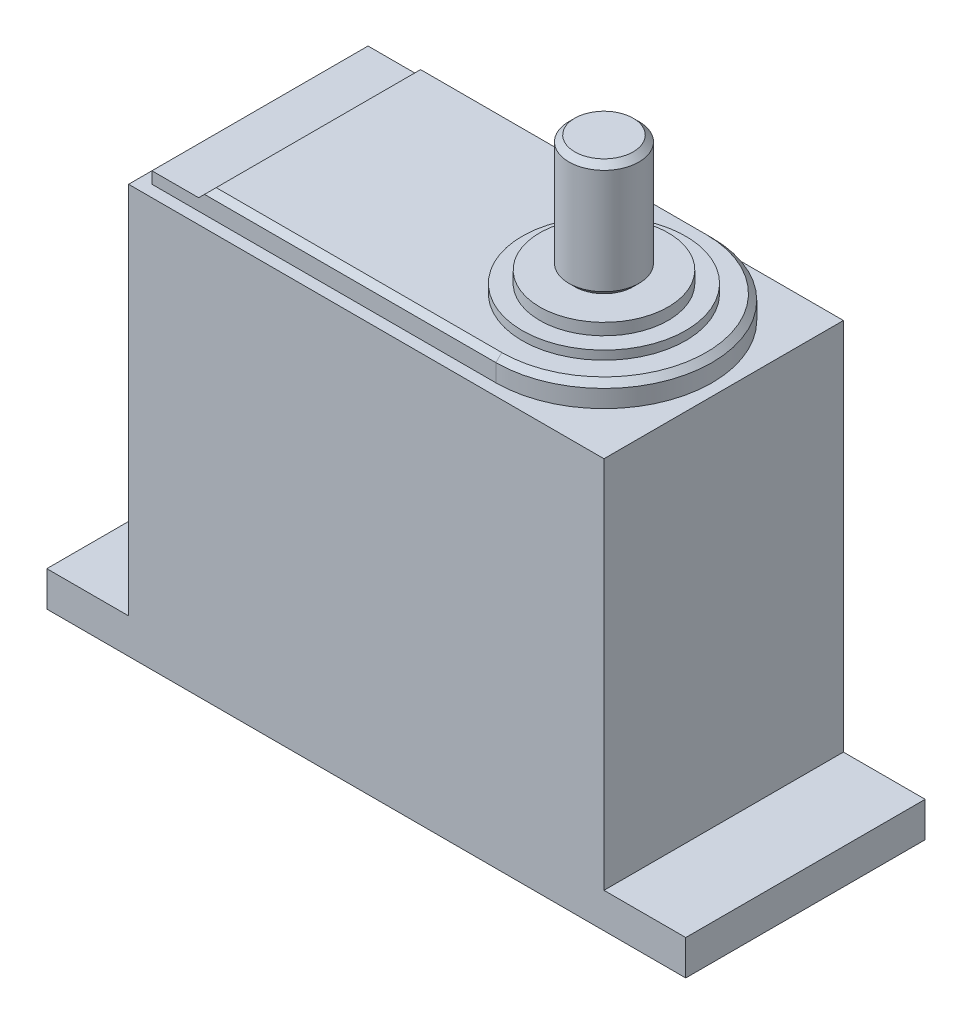
ISO-10303-21;
HEADER;
FILE_DESCRIPTION(('STEP AP214'),'2;1');
FILE_NAME('part.step','',(''),(''),'','','');
FILE_SCHEMA(('AUTOMOTIVE_DESIGN { 1 0 10303 214 1 1 1 1 }'));
ENDSEC;
DATA;
#1=APPLICATION_CONTEXT('core data for automotive mechanical design processes');
#2=APPLICATION_PROTOCOL_DEFINITION('international standard','automotive_design',2000,#1);
#3=PRODUCT_CONTEXT('',#1,'mechanical');
#4=PRODUCT('Part','Part','',(#3));
#5=PRODUCT_RELATED_PRODUCT_CATEGORY('part','',(#4));
#6=PRODUCT_DEFINITION_FORMATION('','',#4);
#7=PRODUCT_DEFINITION_CONTEXT('part definition',#1,'design');
#8=PRODUCT_DEFINITION('design','',#6,#7);
#9=PRODUCT_DEFINITION_SHAPE('','',#8);
#10=(LENGTH_UNIT() NAMED_UNIT(*) SI_UNIT(.MILLI.,.METRE.));
#11=(NAMED_UNIT(*) PLANE_ANGLE_UNIT() SI_UNIT($,.RADIAN.));
#12=(NAMED_UNIT(*) SI_UNIT($,.STERADIAN.) SOLID_ANGLE_UNIT());
#13=UNCERTAINTY_MEASURE_WITH_UNIT(LENGTH_MEASURE(1.E-05),#10,'distance_accuracy_value','');
#14=(GEOMETRIC_REPRESENTATION_CONTEXT(3) GLOBAL_UNCERTAINTY_ASSIGNED_CONTEXT((#13)) GLOBAL_UNIT_ASSIGNED_CONTEXT((#10,
#11,#12)) REPRESENTATION_CONTEXT('',''));
#15=CARTESIAN_POINT('',(0.,0.,0.));
#16=DIRECTION('',(0.,0.,1.));
#17=DIRECTION('',(1.,0.,0.));
#18=AXIS2_PLACEMENT_3D('',#15,#16,#17);
#19=CARTESIAN_POINT('',(10.1,21.25,0.));
#20=DIRECTION('',(0.,1.,0.));
#21=DIRECTION('',(0.,0.,1.));
#22=AXIS2_PLACEMENT_3D('',#19,#20,#21);
#23=PLANE('',#22);
#24=CARTESIAN_POINT('',(10.1,21.25,0.));
#25=DIRECTION('',(0.,1.,0.));
#26=DIRECTION('',(0.,0.,1.));
#27=AXIS2_PLACEMENT_3D('',#24,#25,#26);
#28=CIRCLE('',#27,5.5);
#29=CARTESIAN_POINT('',(10.1,21.25,5.5));
#30=VERTEX_POINT('',#29);
#31=EDGE_CURVE('E232',#30,#30,#28,.T.);
#32=ORIENTED_EDGE('',*,*,#31,.T.);
#33=EDGE_LOOP('',(#32));
#34=FACE_BOUND('',#33,.T.);
#35=CARTESIAN_POINT('',(10.1,21.25,0.));
#36=DIRECTION('',(0.,1.,0.));
#37=DIRECTION('',(0.,0.,1.));
#38=AXIS2_PLACEMENT_3D('',#35,#36,#37);
#39=CIRCLE('',#38,2.5);
#40=CARTESIAN_POINT('',(10.1,21.25,2.5));
#41=VERTEX_POINT('',#40);
#42=EDGE_CURVE('E223',#41,#41,#39,.T.);
#43=ORIENTED_EDGE('',*,*,#42,.F.);
#44=EDGE_LOOP('',(#43));
#45=FACE_BOUND('',#44,.T.);
#46=ADVANCED_FACE('F34',(#34,#45),#23,.T.);
#47=CARTESIAN_POINT('',(10.1,20.25,0.));
#48=DIRECTION('',(0.,1.,0.));
#49=DIRECTION('',(0.,0.,1.));
#50=AXIS2_PLACEMENT_3D('',#47,#48,#49);
#51=PLANE('',#50);
#52=CARTESIAN_POINT('',(10.1,20.25,0.));
#53=DIRECTION('',(0.,1.,0.));
#54=DIRECTION('',(0.,0.,1.));
#55=AXIS2_PLACEMENT_3D('',#52,#53,#54);
#56=CIRCLE('',#55,7.);
#57=CARTESIAN_POINT('',(10.1,20.25,7.));
#58=VERTEX_POINT('',#57);
#59=EDGE_CURVE('E238',#58,#58,#56,.T.);
#60=ORIENTED_EDGE('',*,*,#59,.T.);
#61=EDGE_LOOP('',(#60));
#62=FACE_BOUND('',#61,.T.);
#63=CARTESIAN_POINT('',(10.1,20.25,0.));
#64=DIRECTION('',(0.,1.,0.));
#65=DIRECTION('',(0.,0.,1.));
#66=AXIS2_PLACEMENT_3D('',#63,#64,#65);
#67=CIRCLE('',#66,5.5);
#68=CARTESIAN_POINT('',(10.1,20.25,5.5));
#69=VERTEX_POINT('',#68);
#70=EDGE_CURVE('E221',#69,#69,#67,.T.);
#71=ORIENTED_EDGE('',*,*,#70,.F.);
#72=EDGE_LOOP('',(#71));
#73=FACE_BOUND('',#72,.T.);
#74=ADVANCED_FACE('F327',(#62,#73),#51,.T.);
#75=CARTESIAN_POINT('',(10.1,19.5,0.));
#76=DIRECTION('',(0.,1.,0.));
#77=DIRECTION('',(0.,0.,1.));
#78=AXIS2_PLACEMENT_3D('',#75,#76,#77);
#79=PLANE('',#78);
#80=CARTESIAN_POINT('',(10.1,19.5,0.));
#81=DIRECTION('',(0.,1.,0.));
#82=DIRECTION('',(0.,0.,1.));
#83=AXIS2_PLACEMENT_3D('',#80,#81,#82);
#84=CIRCLE('',#83,8.75);
#85=CARTESIAN_POINT('',(10.1,19.5,8.75));
#86=VERTEX_POINT('',#85);
#87=CARTESIAN_POINT('',(10.1,19.5,-8.75000000000001));
#88=VERTEX_POINT('',#87);
#89=EDGE_CURVE('E202',#86,#88,#84,.T.);
#90=ORIENTED_EDGE('',*,*,#89,.T.);
#91=DIRECTION('',(-1.,0.,0.));
#92=VECTOR('',#91,1.);
#93=CARTESIAN_POINT('',(-14.35,19.5,-8.75000000000001));
#94=LINE('',#93,#92);
#95=CARTESIAN_POINT('',(-14.35,19.5,-8.75000000000001));
#96=VERTEX_POINT('',#95);
#97=EDGE_CURVE('E204',#88,#96,#94,.T.);
#98=ORIENTED_EDGE('',*,*,#97,.T.);
#99=DIRECTION('',(0.,0.,1.));
#100=VECTOR('',#99,1.);
#101=CARTESIAN_POINT('',(-14.35,19.5,-9.25));
#102=LINE('',#101,#100);
#103=CARTESIAN_POINT('',(-14.35,19.5,8.75000000000001));
#104=VERTEX_POINT('',#103);
#105=EDGE_CURVE('E256',#96,#104,#102,.T.);
#106=ORIENTED_EDGE('',*,*,#105,.T.);
#107=DIRECTION('',(1.,0.,0.));
#108=VECTOR('',#107,1.);
#109=CARTESIAN_POINT('',(10.1,19.5,8.75));
#110=LINE('',#109,#108);
#111=EDGE_CURVE('E200',#104,#86,#110,.T.);
#112=ORIENTED_EDGE('',*,*,#111,.T.);
#113=EDGE_LOOP('',(#90,#98,#106,#112));
#114=FACE_BOUND('',#113,.T.);
#115=CARTESIAN_POINT('',(10.1,19.5,0.));
#116=DIRECTION('',(0.,1.,0.));
#117=DIRECTION('',(0.,0.,1.));
#118=AXIS2_PLACEMENT_3D('',#115,#116,#117);
#119=CIRCLE('',#118,7.);
#120=CARTESIAN_POINT('',(10.1,19.5,7.));
#121=VERTEX_POINT('',#120);
#122=EDGE_CURVE('E235',#121,#121,#119,.T.);
#123=ORIENTED_EDGE('',*,*,#122,.F.);
#124=EDGE_LOOP('',(#123));
#125=FACE_BOUND('',#124,.T.);
#126=ADVANCED_FACE('F333',(#114,#125),#79,.T.);
#127=CARTESIAN_POINT('',(-20.35,17.5,10.25));
#128=DIRECTION('',(0.,-1.,0.));
#129=DIRECTION('',(0.,0.,-1.));
#130=AXIS2_PLACEMENT_3D('',#127,#128,#129);
#131=PLANE('',#130);
#132=DIRECTION('',(-1.,0.,0.));
#133=VECTOR('',#132,1.);
#134=CARTESIAN_POINT('',(-20.35,17.5,-10.25));
#135=LINE('',#134,#133);
#136=CARTESIAN_POINT('',(20.35,17.5,-10.25));
#137=VERTEX_POINT('',#136);
#138=CARTESIAN_POINT('',(-20.35,17.5,-10.25));
#139=VERTEX_POINT('',#138);
#140=EDGE_CURVE('E187',#137,#139,#135,.T.);
#141=ORIENTED_EDGE('',*,*,#140,.T.);
#142=DIRECTION('',(0.,0.,-1.));
#143=VECTOR('',#142,1.);
#144=CARTESIAN_POINT('',(-20.35,17.5,10.25));
#145=LINE('',#144,#143);
#146=CARTESIAN_POINT('',(-20.35,17.5,10.25));
#147=VERTEX_POINT('',#146);
#148=EDGE_CURVE('E184',#147,#139,#145,.T.);
#149=ORIENTED_EDGE('',*,*,#148,.F.);
#150=DIRECTION('',(-1.,0.,0.));
#151=VECTOR('',#150,1.);
#152=CARTESIAN_POINT('',(-20.35,17.5,10.25));
#153=LINE('',#152,#151);
#154=CARTESIAN_POINT('',(20.35,17.5,10.25));
#155=VERTEX_POINT('',#154);
#156=EDGE_CURVE('E169',#155,#147,#153,.T.);
#157=ORIENTED_EDGE('',*,*,#156,.F.);
#158=DIRECTION('',(0.,0.,-1.));
#159=VECTOR('',#158,1.);
#160=CARTESIAN_POINT('',(20.35,17.5,10.25));
#161=LINE('',#160,#159);
#162=EDGE_CURVE('E168',#155,#137,#161,.T.);
#163=ORIENTED_EDGE('',*,*,#162,.T.);
#164=EDGE_LOOP('',(#141,#149,#157,#163));
#165=FACE_BOUND('',#164,.T.);
#166=DIRECTION('',(0.,0.,1.));
#167=VECTOR('',#166,1.);
#168=CARTESIAN_POINT('',(-19.35,17.5,9.25));
#169=LINE('',#168,#167);
#170=CARTESIAN_POINT('',(-19.35,17.5,-9.25));
#171=VERTEX_POINT('',#170);
#172=CARTESIAN_POINT('',(-19.35,17.5,9.25));
#173=VERTEX_POINT('',#172);
#174=EDGE_CURVE('E259',#171,#173,#169,.T.);
#175=ORIENTED_EDGE('',*,*,#174,.F.);
#176=DIRECTION('',(-1.,0.,0.));
#177=VECTOR('',#176,1.);
#178=CARTESIAN_POINT('',(10.1,17.5,-9.25));
#179=LINE('',#178,#177);
#180=CARTESIAN_POINT('',(10.1,17.5,-9.25000000000001));
#181=VERTEX_POINT('',#180);
#182=EDGE_CURVE('E271',#181,#171,#179,.T.);
#183=ORIENTED_EDGE('',*,*,#182,.F.);
#184=CARTESIAN_POINT('',(10.1,17.5,0.));
#185=DIRECTION('',(0.,1.,0.));
#186=DIRECTION('',(0.,0.,1.));
#187=AXIS2_PLACEMENT_3D('',#184,#185,#186);
#188=CIRCLE('',#187,9.25);
#189=CARTESIAN_POINT('',(10.1,17.5,9.24999999999999));
#190=VERTEX_POINT('',#189);
#191=EDGE_CURVE('E268',#190,#181,#188,.T.);
#192=ORIENTED_EDGE('',*,*,#191,.F.);
#193=DIRECTION('',(1.,0.,0.));
#194=VECTOR('',#193,1.);
#195=CARTESIAN_POINT('',(10.1,17.5,9.24999999999999));
#196=LINE('',#195,#194);
#197=EDGE_CURVE('E265',#173,#190,#196,.T.);
#198=ORIENTED_EDGE('',*,*,#197,.F.);
#199=EDGE_LOOP('',(#175,#183,#192,#198));
#200=FACE_BOUND('',#199,.T.);
#201=ADVANCED_FACE('F291',(#165,#200),#131,.F.);
#202=CARTESIAN_POINT('',(20.35,-17.5,10.25));
#203=DIRECTION('',(-1.,0.,0.));
#204=DIRECTION('',(0.,0.,1.));
#205=AXIS2_PLACEMENT_3D('',#202,#203,#204);
#206=PLANE('',#205);
#207=DIRECTION('',(0.,1.,0.));
#208=VECTOR('',#207,1.);
#209=CARTESIAN_POINT('',(20.35,-17.5,10.25));
#210=LINE('',#209,#208);
#211=CARTESIAN_POINT('',(20.35,-14.5,10.25));
#212=VERTEX_POINT('',#211);
#213=EDGE_CURVE('E159',#212,#155,#210,.T.);
#214=ORIENTED_EDGE('',*,*,#213,.F.);
#215=DIRECTION('',(0.,0.,-1.));
#216=VECTOR('',#215,1.);
#217=CARTESIAN_POINT('',(20.35,-14.5,10.25));
#218=LINE('',#217,#216);
#219=CARTESIAN_POINT('',(20.35,-14.5,-10.25));
#220=VERTEX_POINT('',#219);
#221=EDGE_CURVE('E148',#212,#220,#218,.T.);
#222=ORIENTED_EDGE('',*,*,#221,.T.);
#223=DIRECTION('',(0.,1.,0.));
#224=VECTOR('',#223,1.);
#225=CARTESIAN_POINT('',(20.35,-17.5,-10.25));
#226=LINE('',#225,#224);
#227=EDGE_CURVE('E185',#220,#137,#226,.T.);
#228=ORIENTED_EDGE('',*,*,#227,.T.);
#229=ORIENTED_EDGE('',*,*,#162,.F.);
#230=EDGE_LOOP('',(#214,#222,#228,#229));
#231=FACE_BOUND('',#230,.T.);
#232=ADVANCED_FACE('F166',(#231),#206,.F.);
#233=CARTESIAN_POINT('',(-20.35,-17.5,10.25));
#234=DIRECTION('',(1.,0.,0.));
#235=DIRECTION('',(0.,0.,-1.));
#236=AXIS2_PLACEMENT_3D('',#233,#234,#235);
#237=PLANE('',#236);
#238=DIRECTION('',(0.,-1.,0.));
#239=VECTOR('',#238,1.);
#240=CARTESIAN_POINT('',(-20.35,-17.5,-10.25));
#241=LINE('',#240,#239);
#242=CARTESIAN_POINT('',(-20.35,-14.5,-10.25));
#243=VERTEX_POINT('',#242);
#244=EDGE_CURVE('E174',#139,#243,#241,.T.);
#245=ORIENTED_EDGE('',*,*,#244,.T.);
#246=DIRECTION('',(0.,0.,1.));
#247=VECTOR('',#246,1.);
#248=CARTESIAN_POINT('',(-20.35,-14.5,10.25));
#249=LINE('',#248,#247);
#250=CARTESIAN_POINT('',(-20.35,-14.5,10.25));
#251=VERTEX_POINT('',#250);
#252=EDGE_CURVE('E607',#243,#251,#249,.T.);
#253=ORIENTED_EDGE('',*,*,#252,.T.);
#254=DIRECTION('',(0.,-1.,0.));
#255=VECTOR('',#254,1.);
#256=CARTESIAN_POINT('',(-20.35,-17.5,10.25));
#257=LINE('',#256,#255);
#258=EDGE_CURVE('E172',#147,#251,#257,.T.);
#259=ORIENTED_EDGE('',*,*,#258,.F.);
#260=ORIENTED_EDGE('',*,*,#148,.T.);
#261=EDGE_LOOP('',(#245,#253,#259,#260));
#262=FACE_BOUND('',#261,.T.);
#263=ADVANCED_FACE('F367',(#262),#237,.F.);
#264=CARTESIAN_POINT('',(-20.35,-17.5,10.25));
#265=DIRECTION('',(0.,1.,0.));
#266=DIRECTION('',(0.,0.,1.));
#267=AXIS2_PLACEMENT_3D('',#264,#265,#266);
#268=PLANE('',#267);
#269=DIRECTION('',(1.,0.,0.));
#270=VECTOR('',#269,1.);
#271=CARTESIAN_POINT('',(-20.35,-17.5,-10.25));
#272=LINE('',#271,#270);
#273=CARTESIAN_POINT('',(-27.35,-17.5,-10.25));
#274=VERTEX_POINT('',#273);
#275=CARTESIAN_POINT('',(27.35,-17.5,-10.25));
#276=VERTEX_POINT('',#275);
#277=EDGE_CURVE('E170',#274,#276,#272,.T.);
#278=ORIENTED_EDGE('',*,*,#277,.T.);
#279=DIRECTION('',(0.,0.,1.));
#280=VECTOR('',#279,1.);
#281=CARTESIAN_POINT('',(27.35,-17.5,10.25));
#282=LINE('',#281,#280);
#283=CARTESIAN_POINT('',(27.35,-17.5,10.25));
#284=VERTEX_POINT('',#283);
#285=EDGE_CURVE('E163',#276,#284,#282,.T.);
#286=ORIENTED_EDGE('',*,*,#285,.T.);
#287=DIRECTION('',(1.,0.,0.));
#288=VECTOR('',#287,1.);
#289=CARTESIAN_POINT('',(-20.35,-17.5,10.25));
#290=LINE('',#289,#288);
#291=CARTESIAN_POINT('',(-27.35,-17.5,10.25));
#292=VERTEX_POINT('',#291);
#293=EDGE_CURVE('E182',#292,#284,#290,.T.);
#294=ORIENTED_EDGE('',*,*,#293,.F.);
#295=DIRECTION('',(0.,0.,-1.));
#296=VECTOR('',#295,1.);
#297=CARTESIAN_POINT('',(-27.35,-17.5,10.25));
#298=LINE('',#297,#296);
#299=EDGE_CURVE('E605',#292,#274,#298,.T.);
#300=ORIENTED_EDGE('',*,*,#299,.T.);
#301=EDGE_LOOP('',(#278,#286,#294,#300));
#302=FACE_BOUND('',#301,.T.);
#303=ADVANCED_FACE('F373',(#302),#268,.F.);
#304=CARTESIAN_POINT('',(0.,0.,10.25));
#305=DIRECTION('',(0.,0.,-1.));
#306=DIRECTION('',(-1.,0.,0.));
#307=AXIS2_PLACEMENT_3D('',#304,#305,#306);
#308=PLANE('',#307);
#309=ORIENTED_EDGE('',*,*,#293,.T.);
#310=DIRECTION('',(0.,-1.,0.));
#311=VECTOR('',#310,1.);
#312=CARTESIAN_POINT('',(27.35,-14.5,10.25));
#313=LINE('',#312,#311);
#314=CARTESIAN_POINT('',(27.35,-14.5,10.25));
#315=VERTEX_POINT('',#314);
#316=EDGE_CURVE('E162',#315,#284,#313,.T.);
#317=ORIENTED_EDGE('',*,*,#316,.F.);
#318=DIRECTION('',(-1.,0.,0.));
#319=VECTOR('',#318,1.);
#320=CARTESIAN_POINT('',(20.35,-14.5,10.25));
#321=LINE('',#320,#319);
#322=EDGE_CURVE('E151',#315,#212,#321,.T.);
#323=ORIENTED_EDGE('',*,*,#322,.T.);
#324=ORIENTED_EDGE('',*,*,#213,.T.);
#325=ORIENTED_EDGE('',*,*,#156,.T.);
#326=ORIENTED_EDGE('',*,*,#258,.T.);
#327=DIRECTION('',(-1.,0.,0.));
#328=VECTOR('',#327,1.);
#329=CARTESIAN_POINT('',(-20.35,-14.5,10.25));
#330=LINE('',#329,#328);
#331=CARTESIAN_POINT('',(-27.35,-14.5,10.25));
#332=VERTEX_POINT('',#331);
#333=EDGE_CURVE('E59',#251,#332,#330,.T.);
#334=ORIENTED_EDGE('',*,*,#333,.T.);
#335=DIRECTION('',(0.,-1.,0.));
#336=VECTOR('',#335,1.);
#337=CARTESIAN_POINT('',(-27.35,-14.5,10.25));
#338=LINE('',#337,#336);
#339=EDGE_CURVE('E616',#332,#292,#338,.T.);
#340=ORIENTED_EDGE('',*,*,#339,.T.);
#341=EDGE_LOOP('',(#309,#317,#323,#324,#325,#326,#334,#340));
#342=FACE_BOUND('',#341,.T.);
#343=ADVANCED_FACE('F158',(#342),#308,.F.);
#344=CARTESIAN_POINT('',(0.,0.,-10.25));
#345=DIRECTION('',(0.,0.,-1.));
#346=DIRECTION('',(-1.,0.,0.));
#347=AXIS2_PLACEMENT_3D('',#344,#345,#346);
#348=PLANE('',#347);
#349=ORIENTED_EDGE('',*,*,#227,.F.);
#350=DIRECTION('',(1.,0.,0.));
#351=VECTOR('',#350,1.);
#352=CARTESIAN_POINT('',(20.35,-14.5,-10.25));
#353=LINE('',#352,#351);
#354=CARTESIAN_POINT('',(27.35,-14.5,-10.25));
#355=VERTEX_POINT('',#354);
#356=EDGE_CURVE('E51',#220,#355,#353,.T.);
#357=ORIENTED_EDGE('',*,*,#356,.T.);
#358=DIRECTION('',(0.,-1.,0.));
#359=VECTOR('',#358,1.);
#360=CARTESIAN_POINT('',(27.35,-14.5,-10.25));
#361=LINE('',#360,#359);
#362=EDGE_CURVE('E598',#355,#276,#361,.T.);
#363=ORIENTED_EDGE('',*,*,#362,.T.);
#364=ORIENTED_EDGE('',*,*,#277,.F.);
#365=DIRECTION('',(0.,-1.,0.));
#366=VECTOR('',#365,1.);
#367=CARTESIAN_POINT('',(-27.35,-14.5,-10.25));
#368=LINE('',#367,#366);
#369=CARTESIAN_POINT('',(-27.35,-14.5,-10.25));
#370=VERTEX_POINT('',#369);
#371=EDGE_CURVE('E228',#370,#274,#368,.T.);
#372=ORIENTED_EDGE('',*,*,#371,.F.);
#373=DIRECTION('',(1.,0.,0.));
#374=VECTOR('',#373,1.);
#375=CARTESIAN_POINT('',(-20.35,-14.5,-10.25));
#376=LINE('',#375,#374);
#377=EDGE_CURVE('E613',#370,#243,#376,.T.);
#378=ORIENTED_EDGE('',*,*,#377,.T.);
#379=ORIENTED_EDGE('',*,*,#244,.F.);
#380=ORIENTED_EDGE('',*,*,#140,.F.);
#381=EDGE_LOOP('',(#349,#357,#363,#364,#372,#378,#379,#380));
#382=FACE_BOUND('',#381,.T.);
#383=ADVANCED_FACE('F378',(#382),#348,.T.);
#384=CARTESIAN_POINT('',(-19.35,19.5,9.25));
#385=DIRECTION('',(1.,0.,0.));
#386=DIRECTION('',(0.,0.,-1.));
#387=AXIS2_PLACEMENT_3D('',#384,#385,#386);
#388=PLANE('',#387);
#389=DIRECTION('',(0.,-1.,0.));
#390=VECTOR('',#389,1.);
#391=CARTESIAN_POINT('',(-19.35,19.5,9.25));
#392=LINE('',#391,#390);
#393=CARTESIAN_POINT('',(-19.35,18.5,9.25));
#394=VERTEX_POINT('',#393);
#395=EDGE_CURVE('E177',#394,#173,#392,.T.);
#396=ORIENTED_EDGE('',*,*,#395,.F.);
#397=DIRECTION('',(0.,0.,1.));
#398=VECTOR('',#397,1.);
#399=CARTESIAN_POINT('',(-19.35,18.5,-9.25));
#400=LINE('',#399,#398);
#401=CARTESIAN_POINT('',(-19.35,18.5,-9.25));
#402=VERTEX_POINT('',#401);
#403=EDGE_CURVE('E251',#402,#394,#400,.T.);
#404=ORIENTED_EDGE('',*,*,#403,.F.);
#405=DIRECTION('',(0.,-1.,0.));
#406=VECTOR('',#405,1.);
#407=CARTESIAN_POINT('',(-19.35,19.5,-9.25));
#408=LINE('',#407,#406);
#409=EDGE_CURVE('E274',#402,#171,#408,.T.);
#410=ORIENTED_EDGE('',*,*,#409,.T.);
#411=ORIENTED_EDGE('',*,*,#174,.T.);
#412=EDGE_LOOP('',(#396,#404,#410,#411));
#413=FACE_BOUND('',#412,.T.);
#414=ADVANCED_FACE('F293',(#413),#388,.F.);
#415=CARTESIAN_POINT('',(10.1,19.5,9.24999999999999));
#416=DIRECTION('',(0.,0.,-1.));
#417=DIRECTION('',(-1.,0.,0.));
#418=AXIS2_PLACEMENT_3D('',#415,#416,#417);
#419=PLANE('',#418);
#420=DIRECTION('',(0.,-1.,0.));
#421=VECTOR('',#420,1.);
#422=CARTESIAN_POINT('',(10.1,19.5,9.24999999999999));
#423=LINE('',#422,#421);
#424=CARTESIAN_POINT('',(10.1,19.,9.24999999999999));
#425=VERTEX_POINT('',#424);
#426=EDGE_CURVE('E277',#425,#190,#423,.T.);
#427=ORIENTED_EDGE('',*,*,#426,.F.);
#428=DIRECTION('',(-1.,0.,0.));
#429=VECTOR('',#428,1.);
#430=CARTESIAN_POINT('',(-14.35,19.,9.25));
#431=LINE('',#430,#429);
#432=CARTESIAN_POINT('',(-14.85,19.,9.25));
#433=VERTEX_POINT('',#432);
#434=EDGE_CURVE('E11',#425,#433,#431,.T.);
#435=ORIENTED_EDGE('',*,*,#434,.T.);
#436=DIRECTION('',(0.707106781186552,0.707106781186542,0.));
#437=VECTOR('',#436,1.);
#438=CARTESIAN_POINT('',(-15.35,18.5,9.25));
#439=LINE('',#438,#437);
#440=CARTESIAN_POINT('',(-15.35,18.5,9.25));
#441=VERTEX_POINT('',#440);
#442=EDGE_CURVE('E248',#441,#433,#439,.T.);
#443=ORIENTED_EDGE('',*,*,#442,.F.);
#444=DIRECTION('',(1.,0.,0.));
#445=VECTOR('',#444,1.);
#446=CARTESIAN_POINT('',(-19.35,18.5,9.25));
#447=LINE('',#446,#445);
#448=EDGE_CURVE('E241',#394,#441,#447,.T.);
#449=ORIENTED_EDGE('',*,*,#448,.F.);
#450=ORIENTED_EDGE('',*,*,#395,.T.);
#451=ORIENTED_EDGE('',*,*,#197,.T.);
#452=EDGE_LOOP('',(#427,#435,#443,#449,#450,#451));
#453=FACE_BOUND('',#452,.T.);
#454=ADVANCED_FACE('F285',(#453),#419,.F.);
#455=CARTESIAN_POINT('',(10.1,19.5,0.));
#456=DIRECTION('',(0.,-1.,0.));
#457=DIRECTION('',(0.,0.,-1.));
#458=AXIS2_PLACEMENT_3D('',#455,#456,#457);
#459=CYLINDRICAL_SURFACE('',#458,9.25);
#460=DIRECTION('',(0.,-1.,0.));
#461=VECTOR('',#460,1.);
#462=CARTESIAN_POINT('',(10.1,19.5,-9.25));
#463=LINE('',#462,#461);
#464=CARTESIAN_POINT('',(10.1,19.,-9.25));
#465=VERTEX_POINT('',#464);
#466=EDGE_CURVE('E276',#465,#181,#463,.T.);
#467=ORIENTED_EDGE('',*,*,#466,.F.);
#468=CARTESIAN_POINT('',(10.1,19.,0.));
#469=DIRECTION('',(0.,1.,0.));
#470=DIRECTION('',(0.,0.,1.));
#471=AXIS2_PLACEMENT_3D('',#468,#469,#470);
#472=CIRCLE('',#471,9.25);
#473=EDGE_CURVE('E43',#465,#425,#472,.F.);
#474=ORIENTED_EDGE('',*,*,#473,.T.);
#475=ORIENTED_EDGE('',*,*,#426,.T.);
#476=ORIENTED_EDGE('',*,*,#191,.T.);
#477=EDGE_LOOP('',(#467,#474,#475,#476));
#478=FACE_BOUND('',#477,.T.);
#479=ADVANCED_FACE('F298',(#478),#459,.T.);
#480=CARTESIAN_POINT('',(10.1,19.5,-9.25));
#481=DIRECTION('',(0.,0.,1.));
#482=DIRECTION('',(1.,0.,0.));
#483=AXIS2_PLACEMENT_3D('',#480,#481,#482);
#484=PLANE('',#483);
#485=DIRECTION('',(0.707106781186552,0.707106781186542,0.));
#486=VECTOR('',#485,1.);
#487=CARTESIAN_POINT('',(-15.35,18.5,-9.25));
#488=LINE('',#487,#486);
#489=CARTESIAN_POINT('',(-15.35,18.5,-9.25));
#490=VERTEX_POINT('',#489);
#491=CARTESIAN_POINT('',(-14.85,19.,-9.25));
#492=VERTEX_POINT('',#491);
#493=EDGE_CURVE('E247',#490,#492,#488,.T.);
#494=ORIENTED_EDGE('',*,*,#493,.T.);
#495=DIRECTION('',(1.,0.,0.));
#496=VECTOR('',#495,1.);
#497=CARTESIAN_POINT('',(10.1,19.,-9.25));
#498=LINE('',#497,#496);
#499=EDGE_CURVE('E211',#492,#465,#498,.T.);
#500=ORIENTED_EDGE('',*,*,#499,.T.);
#501=ORIENTED_EDGE('',*,*,#466,.T.);
#502=ORIENTED_EDGE('',*,*,#182,.T.);
#503=ORIENTED_EDGE('',*,*,#409,.F.);
#504=DIRECTION('',(1.,0.,0.));
#505=VECTOR('',#504,1.);
#506=CARTESIAN_POINT('',(-19.35,18.5,-9.25));
#507=LINE('',#506,#505);
#508=EDGE_CURVE('E244',#402,#490,#507,.T.);
#509=ORIENTED_EDGE('',*,*,#508,.T.);
#510=EDGE_LOOP('',(#494,#500,#501,#502,#503,#509));
#511=FACE_BOUND('',#510,.T.);
#512=ADVANCED_FACE('F296',(#511),#484,.F.);
#513=CARTESIAN_POINT('',(-15.35,18.5,-9.25));
#514=DIRECTION('',(0.707106781186543,-0.707106781186553,0.));
#515=DIRECTION('',(0.707106781186553,0.707106781186543,0.));
#516=AXIS2_PLACEMENT_3D('',#513,#514,#515);
#517=PLANE('',#516);
#518=ORIENTED_EDGE('',*,*,#105,.F.);
#519=DIRECTION('',(-0.577350269189634,-0.577350269189626,-0.577350269189618));
#520=VECTOR('',#519,1.);
#521=CARTESIAN_POINT('',(-6.19999999999977,27.6500000000001,-0.600000000000005));
#522=LINE('',#521,#520);
#523=EDGE_CURVE('E209',#96,#492,#522,.T.);
#524=ORIENTED_EDGE('',*,*,#523,.T.);
#525=ORIENTED_EDGE('',*,*,#493,.F.);
#526=DIRECTION('',(0.,0.,1.));
#527=VECTOR('',#526,1.);
#528=CARTESIAN_POINT('',(-15.35,18.5,-9.25));
#529=LINE('',#528,#527);
#530=EDGE_CURVE('E260',#490,#441,#529,.T.);
#531=ORIENTED_EDGE('',*,*,#530,.T.);
#532=ORIENTED_EDGE('',*,*,#442,.T.);
#533=DIRECTION('',(0.577350269189634,0.577350269189626,-0.577350269189618));
#534=VECTOR('',#533,1.);
#535=CARTESIAN_POINT('',(-6.19999999999976,27.6500000000001,0.600000000000003));
#536=LINE('',#535,#534);
#537=EDGE_CURVE('E207',#433,#104,#536,.T.);
#538=ORIENTED_EDGE('',*,*,#537,.T.);
#539=EDGE_LOOP('',(#518,#524,#525,#531,#532,#538));
#540=FACE_BOUND('',#539,.T.);
#541=ADVANCED_FACE('F310',(#540),#517,.F.);
#542=CARTESIAN_POINT('',(-19.35,18.5,-9.25));
#543=DIRECTION('',(0.,-1.,0.));
#544=DIRECTION('',(0.,0.,-1.));
#545=AXIS2_PLACEMENT_3D('',#542,#543,#544);
#546=PLANE('',#545);
#547=ORIENTED_EDGE('',*,*,#448,.T.);
#548=ORIENTED_EDGE('',*,*,#530,.F.);
#549=ORIENTED_EDGE('',*,*,#508,.F.);
#550=ORIENTED_EDGE('',*,*,#403,.T.);
#551=EDGE_LOOP('',(#547,#548,#549,#550));
#552=FACE_BOUND('',#551,.T.);
#553=ADVANCED_FACE('F313',(#552),#546,.F.);
#554=CARTESIAN_POINT('',(10.1,20.25,0.));
#555=DIRECTION('',(0.,-1.,0.));
#556=DIRECTION('',(0.,0.,-1.));
#557=AXIS2_PLACEMENT_3D('',#554,#555,#556);
#558=CYLINDRICAL_SURFACE('',#557,7.);
#559=ORIENTED_EDGE('',*,*,#59,.F.);
#560=EDGE_LOOP('',(#559));
#561=FACE_BOUND('',#560,.T.);
#562=ORIENTED_EDGE('',*,*,#122,.T.);
#563=EDGE_LOOP('',(#562));
#564=FACE_BOUND('',#563,.T.);
#565=ADVANCED_FACE('F315',(#561,#564),#558,.T.);
#566=CARTESIAN_POINT('',(10.1,21.25,0.));
#567=DIRECTION('',(0.,-1.,0.));
#568=DIRECTION('',(0.,0.,-1.));
#569=AXIS2_PLACEMENT_3D('',#566,#567,#568);
#570=CYLINDRICAL_SURFACE('',#569,5.5);
#571=ORIENTED_EDGE('',*,*,#31,.F.);
#572=EDGE_LOOP('',(#571));
#573=FACE_BOUND('',#572,.T.);
#574=ORIENTED_EDGE('',*,*,#70,.T.);
#575=EDGE_LOOP('',(#574));
#576=FACE_BOUND('',#575,.T.);
#577=ADVANCED_FACE('F321',(#573,#576),#570,.T.);
#578=CARTESIAN_POINT('',(10.1,19.5,8.75));
#579=DIRECTION('',(0.,0.707106781186543,0.707106781186552));
#580=DIRECTION('',(-1.,0.,0.));
#581=AXIS2_PLACEMENT_3D('',#578,#579,#580);
#582=PLANE('',#581);
#583=ORIENTED_EDGE('',*,*,#537,.F.);
#584=ORIENTED_EDGE('',*,*,#434,.F.);
#585=DIRECTION('',(0.,-0.707106781186552,0.707106781186543));
#586=VECTOR('',#585,1.);
#587=CARTESIAN_POINT('',(10.1,19.5,8.75));
#588=LINE('',#587,#586);
#589=EDGE_CURVE('E38',#86,#425,#588,.T.);
#590=ORIENTED_EDGE('',*,*,#589,.F.);
#591=ORIENTED_EDGE('',*,*,#111,.F.);
#592=EDGE_LOOP('',(#583,#584,#590,#591));
#593=FACE_BOUND('',#592,.T.);
#594=ADVANCED_FACE('F36',(#593),#582,.T.);
#595=CARTESIAN_POINT('',(10.1,19.5,0.));
#596=DIRECTION('',(0.,-1.,0.));
#597=DIRECTION('',(0.,0.,-1.));
#598=AXIS2_PLACEMENT_3D('',#595,#596,#597);
#599=CONICAL_SURFACE('',#598,8.75,0.785398163397441);
#600=ORIENTED_EDGE('',*,*,#589,.T.);
#601=ORIENTED_EDGE('',*,*,#473,.F.);
#602=DIRECTION('',(0.,-0.707106781186552,-0.707106781186543));
#603=VECTOR('',#602,1.);
#604=CARTESIAN_POINT('',(10.1,19.5,-8.75000000000001));
#605=LINE('',#604,#603);
#606=EDGE_CURVE('E213',#88,#465,#605,.T.);
#607=ORIENTED_EDGE('',*,*,#606,.F.);
#608=ORIENTED_EDGE('',*,*,#89,.F.);
#609=EDGE_LOOP('',(#600,#601,#607,#608));
#610=FACE_BOUND('',#609,.T.);
#611=ADVANCED_FACE('F301',(#610),#599,.T.);
#612=CARTESIAN_POINT('',(10.1,19.5,-8.75000000000001));
#613=DIRECTION('',(0.,0.707106781186543,-0.707106781186552));
#614=DIRECTION('',(1.,0.,0.));
#615=AXIS2_PLACEMENT_3D('',#612,#613,#614);
#616=PLANE('',#615);
#617=ORIENTED_EDGE('',*,*,#606,.T.);
#618=ORIENTED_EDGE('',*,*,#499,.F.);
#619=ORIENTED_EDGE('',*,*,#523,.F.);
#620=ORIENTED_EDGE('',*,*,#97,.F.);
#621=EDGE_LOOP('',(#617,#618,#619,#620));
#622=FACE_BOUND('',#621,.T.);
#623=ADVANCED_FACE('F353',(#622),#616,.T.);
#624=CARTESIAN_POINT('',(10.1,21.25,0.));
#625=DIRECTION('',(0.,1.,0.));
#626=DIRECTION('',(0.,0.,1.));
#627=AXIS2_PLACEMENT_3D('',#624,#625,#626);
#628=CONICAL_SURFACE('',#627,2.5,0.78539816339745);
#629=CARTESIAN_POINT('',(10.1,21.75,0.));
#630=DIRECTION('',(0.,1.,0.));
#631=DIRECTION('',(0.,0.,1.));
#632=AXIS2_PLACEMENT_3D('',#629,#630,#631);
#633=CIRCLE('',#632,3.);
#634=CARTESIAN_POINT('',(10.1,21.75,3.));
#635=VERTEX_POINT('',#634);
#636=EDGE_CURVE('E215',#635,#635,#633,.T.);
#637=ORIENTED_EDGE('',*,*,#636,.F.);
#638=EDGE_LOOP('',(#637));
#639=FACE_BOUND('',#638,.T.);
#640=ORIENTED_EDGE('',*,*,#42,.T.);
#641=EDGE_LOOP('',(#640));
#642=FACE_BOUND('',#641,.T.);
#643=ADVANCED_FACE('F357',(#639,#642),#628,.T.);
#644=CARTESIAN_POINT('',(10.1,31.25,0.));
#645=DIRECTION('',(0.,1.,0.));
#646=DIRECTION('',(0.,0.,1.));
#647=AXIS2_PLACEMENT_3D('',#644,#645,#646);
#648=PLANE('',#647);
#649=CARTESIAN_POINT('',(10.1,31.25,0.));
#650=DIRECTION('',(0.,1.,0.));
#651=DIRECTION('',(0.,0.,1.));
#652=AXIS2_PLACEMENT_3D('',#649,#650,#651);
#653=CIRCLE('',#652,2.50000000000001);
#654=CARTESIAN_POINT('',(10.1,31.25,2.50000000000001));
#655=VERTEX_POINT('',#654);
#656=EDGE_CURVE('E194',#655,#655,#653,.T.);
#657=ORIENTED_EDGE('',*,*,#656,.T.);
#658=EDGE_LOOP('',(#657));
#659=FACE_BOUND('',#658,.T.);
#660=ADVANCED_FACE('F363',(#659),#648,.T.);
#661=CARTESIAN_POINT('',(10.1,31.25,0.));
#662=DIRECTION('',(0.,-1.,0.));
#663=DIRECTION('',(0.,0.,-1.));
#664=AXIS2_PLACEMENT_3D('',#661,#662,#663);
#665=CONICAL_SURFACE('',#664,2.50000000000001,0.785398163397445);
#666=CARTESIAN_POINT('',(10.1,30.75,0.));
#667=DIRECTION('',(0.,1.,0.));
#668=DIRECTION('',(0.,0.,1.));
#669=AXIS2_PLACEMENT_3D('',#666,#667,#668);
#670=CIRCLE('',#669,3.);
#671=CARTESIAN_POINT('',(10.1,30.75,3.));
#672=VERTEX_POINT('',#671);
#673=EDGE_CURVE('E197',#672,#672,#670,.F.);
#674=ORIENTED_EDGE('',*,*,#673,.F.);
#675=EDGE_LOOP('',(#674));
#676=FACE_BOUND('',#675,.T.);
#677=ORIENTED_EDGE('',*,*,#656,.F.);
#678=EDGE_LOOP('',(#677));
#679=FACE_BOUND('',#678,.T.);
#680=ADVANCED_FACE('F360',(#676,#679),#665,.T.);
#681=CARTESIAN_POINT('',(10.1,31.25,0.));
#682=DIRECTION('',(0.,-1.,0.));
#683=DIRECTION('',(0.,0.,-1.));
#684=AXIS2_PLACEMENT_3D('',#681,#682,#683);
#685=CYLINDRICAL_SURFACE('',#684,3.);
#686=ORIENTED_EDGE('',*,*,#636,.T.);
#687=EDGE_LOOP('',(#686));
#688=FACE_BOUND('',#687,.T.);
#689=ORIENTED_EDGE('',*,*,#673,.T.);
#690=EDGE_LOOP('',(#689));
#691=FACE_BOUND('',#690,.T.);
#692=ADVANCED_FACE('F339',(#688,#691),#685,.T.);
#693=CARTESIAN_POINT('',(-27.35,-14.5,10.25));
#694=DIRECTION('',(-1.,0.,0.));
#695=DIRECTION('',(0.,0.,1.));
#696=AXIS2_PLACEMENT_3D('',#693,#694,#695);
#697=PLANE('',#696);
#698=ORIENTED_EDGE('',*,*,#299,.F.);
#699=ORIENTED_EDGE('',*,*,#339,.F.);
#700=DIRECTION('',(0.,0.,-1.));
#701=VECTOR('',#700,1.);
#702=CARTESIAN_POINT('',(-27.35,-14.5,10.25));
#703=LINE('',#702,#701);
#704=EDGE_CURVE('E610',#332,#370,#703,.T.);
#705=ORIENTED_EDGE('',*,*,#704,.T.);
#706=ORIENTED_EDGE('',*,*,#371,.T.);
#707=EDGE_LOOP('',(#698,#699,#705,#706));
#708=FACE_BOUND('',#707,.T.);
#709=ADVANCED_FACE('F507',(#708),#697,.T.);
#710=CARTESIAN_POINT('',(0.,-14.5,0.));
#711=DIRECTION('',(0.,1.,0.));
#712=DIRECTION('',(0.,0.,1.));
#713=AXIS2_PLACEMENT_3D('',#710,#711,#712);
#714=PLANE('',#713);
#715=ORIENTED_EDGE('',*,*,#252,.F.);
#716=ORIENTED_EDGE('',*,*,#377,.F.);
#717=ORIENTED_EDGE('',*,*,#704,.F.);
#718=ORIENTED_EDGE('',*,*,#333,.F.);
#719=EDGE_LOOP('',(#715,#716,#717,#718));
#720=FACE_BOUND('',#719,.T.);
#721=ADVANCED_FACE('F526',(#720),#714,.T.);
#722=CARTESIAN_POINT('',(27.35,-14.5,10.25));
#723=DIRECTION('',(1.,0.,0.));
#724=DIRECTION('',(0.,0.,-1.));
#725=AXIS2_PLACEMENT_3D('',#722,#723,#724);
#726=PLANE('',#725);
#727=ORIENTED_EDGE('',*,*,#285,.F.);
#728=ORIENTED_EDGE('',*,*,#362,.F.);
#729=DIRECTION('',(0.,0.,1.));
#730=VECTOR('',#729,1.);
#731=CARTESIAN_POINT('',(27.35,-14.5,10.25));
#732=LINE('',#731,#730);
#733=EDGE_CURVE('E602',#355,#315,#732,.T.);
#734=ORIENTED_EDGE('',*,*,#733,.T.);
#735=ORIENTED_EDGE('',*,*,#316,.T.);
#736=EDGE_LOOP('',(#727,#728,#734,#735));
#737=FACE_BOUND('',#736,.T.);
#738=ADVANCED_FACE('F534',(#737),#726,.T.);
#739=CARTESIAN_POINT('',(0.,-14.5,0.));
#740=DIRECTION('',(0.,1.,0.));
#741=DIRECTION('',(0.,0.,1.));
#742=AXIS2_PLACEMENT_3D('',#739,#740,#741);
#743=PLANE('',#742);
#744=ORIENTED_EDGE('',*,*,#322,.F.);
#745=ORIENTED_EDGE('',*,*,#733,.F.);
#746=ORIENTED_EDGE('',*,*,#356,.F.);
#747=ORIENTED_EDGE('',*,*,#221,.F.);
#748=EDGE_LOOP('',(#744,#745,#746,#747));
#749=FACE_BOUND('',#748,.T.);
#750=ADVANCED_FACE('F150',(#749),#743,.T.);
#751=CLOSED_SHELL('',(#46,#74,#126,#201,#232,#263,#303,#343,#383,#414,#454,#479,#512,#541,#553,
#565,#577,#594,#611,#623,#643,#660,#680,#692,#709,#721,#738,#750));
#752=MANIFOLD_SOLID_BREP('B2',#751);
#753=ADVANCED_BREP_SHAPE_REPRESENTATION('',(#18,#752),#14);
#754=SHAPE_DEFINITION_REPRESENTATION(#9,#753);
ENDSEC;
END-ISO-10303-21;
